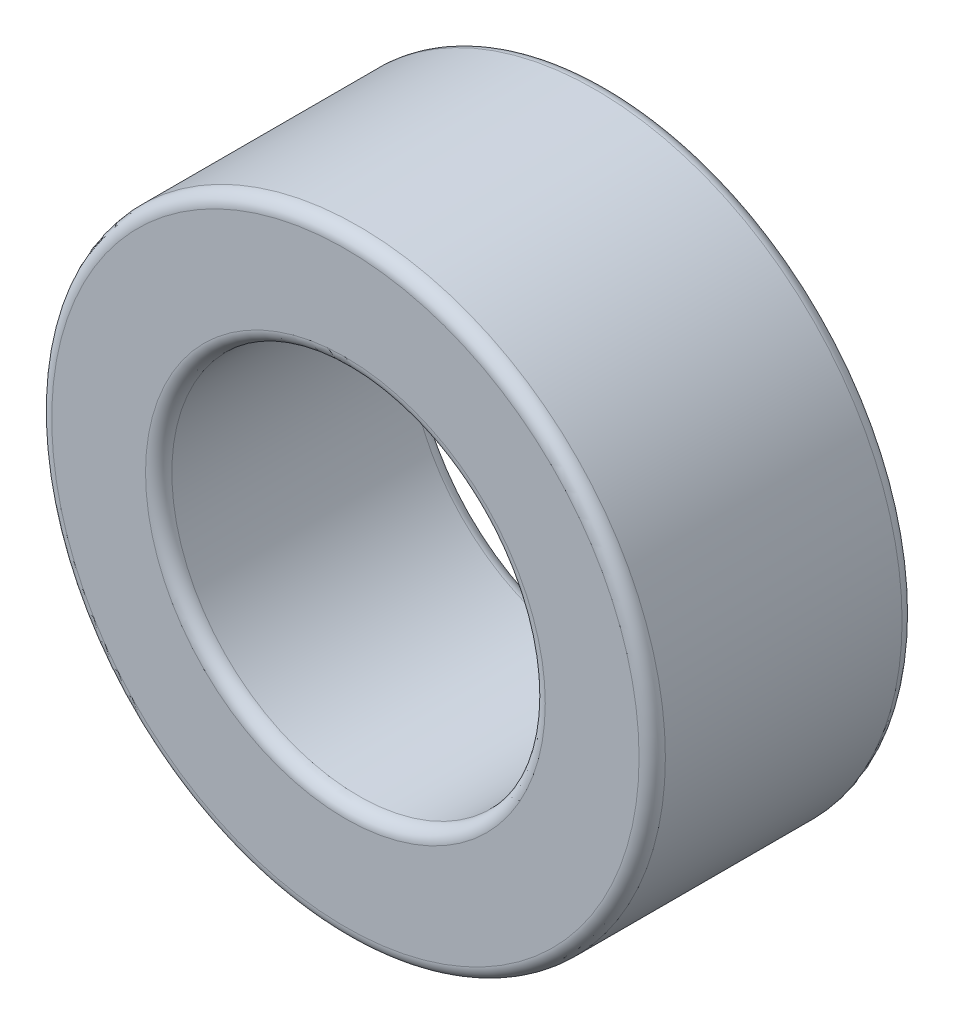
ISO-10303-21;
HEADER;
FILE_DESCRIPTION(('STEP AP214'),'2;1');
FILE_NAME('part.step','',(''),(''),'','','');
FILE_SCHEMA(('AUTOMOTIVE_DESIGN { 1 0 10303 214 1 1 1 1 }'));
ENDSEC;
DATA;
#1=APPLICATION_CONTEXT('core data for automotive mechanical design processes');
#2=APPLICATION_PROTOCOL_DEFINITION('international standard','automotive_design',2000,#1);
#3=PRODUCT_CONTEXT('',#1,'mechanical');
#4=PRODUCT('Part','Part','',(#3));
#5=PRODUCT_RELATED_PRODUCT_CATEGORY('part','',(#4));
#6=PRODUCT_DEFINITION_FORMATION('','',#4);
#7=PRODUCT_DEFINITION_CONTEXT('part definition',#1,'design');
#8=PRODUCT_DEFINITION('design','',#6,#7);
#9=PRODUCT_DEFINITION_SHAPE('','',#8);
#10=(LENGTH_UNIT() NAMED_UNIT(*) SI_UNIT(.MILLI.,.METRE.));
#11=(NAMED_UNIT(*) PLANE_ANGLE_UNIT() SI_UNIT($,.RADIAN.));
#12=(NAMED_UNIT(*) SI_UNIT($,.STERADIAN.) SOLID_ANGLE_UNIT());
#13=UNCERTAINTY_MEASURE_WITH_UNIT(LENGTH_MEASURE(1.E-05),#10,'distance_accuracy_value','');
#14=(GEOMETRIC_REPRESENTATION_CONTEXT(3) GLOBAL_UNCERTAINTY_ASSIGNED_CONTEXT((#13)) GLOBAL_UNIT_ASSIGNED_CONTEXT((#10,
#11,#12)) REPRESENTATION_CONTEXT('',''));
#15=CARTESIAN_POINT('',(0.,0.,0.));
#16=DIRECTION('',(0.,0.,1.));
#17=DIRECTION('',(1.,0.,0.));
#18=AXIS2_PLACEMENT_3D('',#15,#16,#17);
#19=CARTESIAN_POINT('',(0.,0.,3.));
#20=DIRECTION('',(0.,0.,1.));
#21=DIRECTION('',(1.,0.,0.));
#22=AXIS2_PLACEMENT_3D('',#19,#20,#21);
#23=PLANE('',#22);
#24=CARTESIAN_POINT('',(0.,0.,3.));
#25=DIRECTION('',(0.,0.,1.));
#26=DIRECTION('',(1.,0.,0.));
#27=AXIS2_PLACEMENT_3D('',#24,#25,#26);
#28=CIRCLE('',#27,2.28);
#29=CARTESIAN_POINT('',(2.28,0.,3.));
#30=VERTEX_POINT('',#29);
#31=EDGE_CURVE('E50',#30,#30,#28,.F.);
#32=ORIENTED_EDGE('',*,*,#31,.T.);
#33=EDGE_LOOP('',(#32));
#34=FACE_BOUND('',#33,.T.);
#35=CARTESIAN_POINT('',(0.,0.,3.));
#36=DIRECTION('',(0.,0.,1.));
#37=DIRECTION('',(1.,0.,0.));
#38=AXIS2_PLACEMENT_3D('',#35,#36,#37);
#39=CIRCLE('',#38,3.35);
#40=CARTESIAN_POINT('',(3.35,0.,3.));
#41=VERTEX_POINT('',#40);
#42=EDGE_CURVE('E55',#41,#41,#39,.T.);
#43=ORIENTED_EDGE('',*,*,#42,.T.);
#44=EDGE_LOOP('',(#43));
#45=FACE_BOUND('',#44,.T.);
#46=ADVANCED_FACE('F37',(#34,#45),#23,.T.);
#47=CARTESIAN_POINT('',(0.,0.,0.));
#48=DIRECTION('',(0.,0.,1.));
#49=DIRECTION('',(1.,0.,0.));
#50=AXIS2_PLACEMENT_3D('',#47,#48,#49);
#51=PLANE('',#50);
#52=CARTESIAN_POINT('',(0.,0.,0.));
#53=DIRECTION('',(0.,0.,1.));
#54=DIRECTION('',(1.,0.,0.));
#55=AXIS2_PLACEMENT_3D('',#52,#53,#54);
#56=CIRCLE('',#55,2.28);
#57=CARTESIAN_POINT('',(2.28,0.,0.));
#58=VERTEX_POINT('',#57);
#59=EDGE_CURVE('E69',#58,#58,#56,.T.);
#60=ORIENTED_EDGE('',*,*,#59,.T.);
#61=EDGE_LOOP('',(#60));
#62=FACE_BOUND('',#61,.T.);
#63=CARTESIAN_POINT('',(0.,0.,0.));
#64=DIRECTION('',(0.,0.,1.));
#65=DIRECTION('',(1.,0.,0.));
#66=AXIS2_PLACEMENT_3D('',#63,#64,#65);
#67=CIRCLE('',#66,3.35);
#68=CARTESIAN_POINT('',(3.35,0.,0.));
#69=VERTEX_POINT('',#68);
#70=EDGE_CURVE('E73',#69,#69,#67,.F.);
#71=ORIENTED_EDGE('',*,*,#70,.T.);
#72=EDGE_LOOP('',(#71));
#73=FACE_BOUND('',#72,.T.);
#74=ADVANCED_FACE('F78',(#62,#73),#51,.F.);
#75=CARTESIAN_POINT('',(0.,0.,3.));
#76=DIRECTION('',(0.,0.,-1.));
#77=DIRECTION('',(-1.,0.,0.));
#78=AXIS2_PLACEMENT_3D('',#75,#76,#77);
#79=CYLINDRICAL_SURFACE('',#78,3.5);
#80=CARTESIAN_POINT('',(0.,0.,0.15));
#81=DIRECTION('',(0.,0.,1.));
#82=DIRECTION('',(1.,0.,0.));
#83=AXIS2_PLACEMENT_3D('',#80,#81,#82);
#84=CIRCLE('',#83,3.5);
#85=CARTESIAN_POINT('',(3.5,0.,0.15));
#86=VERTEX_POINT('',#85);
#87=EDGE_CURVE('E10',#86,#86,#84,.T.);
#88=ORIENTED_EDGE('',*,*,#87,.T.);
#89=EDGE_LOOP('',(#88));
#90=FACE_BOUND('',#89,.T.);
#91=CARTESIAN_POINT('',(0.,0.,2.85));
#92=DIRECTION('',(0.,0.,1.));
#93=DIRECTION('',(1.,0.,0.));
#94=AXIS2_PLACEMENT_3D('',#91,#92,#93);
#95=CIRCLE('',#94,3.5);
#96=CARTESIAN_POINT('',(3.5,0.,2.85));
#97=VERTEX_POINT('',#96);
#98=EDGE_CURVE('E45',#97,#97,#95,.F.);
#99=ORIENTED_EDGE('',*,*,#98,.T.);
#100=EDGE_LOOP('',(#99));
#101=FACE_BOUND('',#100,.T.);
#102=ADVANCED_FACE('F98',(#90,#101),#79,.T.);
#103=CARTESIAN_POINT('',(0.,0.,3.));
#104=DIRECTION('',(0.,0.,-1.));
#105=DIRECTION('',(-1.,0.,0.));
#106=AXIS2_PLACEMENT_3D('',#103,#104,#105);
#107=CYLINDRICAL_SURFACE('',#106,2.13);
#108=CARTESIAN_POINT('',(0.,0.,0.15));
#109=DIRECTION('',(0.,0.,1.));
#110=DIRECTION('',(1.,0.,0.));
#111=AXIS2_PLACEMENT_3D('',#108,#109,#110);
#112=CIRCLE('',#111,2.13);
#113=CARTESIAN_POINT('',(2.13,0.,0.15));
#114=VERTEX_POINT('',#113);
#115=EDGE_CURVE('E61',#114,#114,#112,.F.);
#116=ORIENTED_EDGE('',*,*,#115,.T.);
#117=EDGE_LOOP('',(#116));
#118=FACE_BOUND('',#117,.T.);
#119=CARTESIAN_POINT('',(0.,0.,2.85));
#120=DIRECTION('',(0.,0.,1.));
#121=DIRECTION('',(1.,0.,0.));
#122=AXIS2_PLACEMENT_3D('',#119,#120,#121);
#123=CIRCLE('',#122,2.13);
#124=CARTESIAN_POINT('',(2.13,0.,2.85));
#125=VERTEX_POINT('',#124);
#126=EDGE_CURVE('E65',#125,#125,#123,.T.);
#127=ORIENTED_EDGE('',*,*,#126,.T.);
#128=EDGE_LOOP('',(#127));
#129=FACE_BOUND('',#128,.T.);
#130=ADVANCED_FACE('F103',(#118,#129),#107,.F.);
#131=CARTESIAN_POINT('',(0.,0.,0.15));
#132=DIRECTION('',(0.,0.,1.));
#133=DIRECTION('',(1.,0.,0.));
#134=AXIS2_PLACEMENT_3D('',#131,#132,#133);
#135=TOROIDAL_SURFACE('',#134,2.28,0.15);
#136=ORIENTED_EDGE('',*,*,#115,.F.);
#137=EDGE_LOOP('',(#136));
#138=FACE_BOUND('',#137,.T.);
#139=ORIENTED_EDGE('',*,*,#59,.F.);
#140=EDGE_LOOP('',(#139));
#141=FACE_BOUND('',#140,.T.);
#142=ADVANCED_FACE('F89',(#138,#141),#135,.T.);
#143=CARTESIAN_POINT('',(0.,0.,2.85));
#144=DIRECTION('',(0.,0.,1.));
#145=DIRECTION('',(1.,0.,0.));
#146=AXIS2_PLACEMENT_3D('',#143,#144,#145);
#147=TOROIDAL_SURFACE('',#146,2.28,0.15);
#148=ORIENTED_EDGE('',*,*,#31,.F.);
#149=EDGE_LOOP('',(#148));
#150=FACE_BOUND('',#149,.T.);
#151=ORIENTED_EDGE('',*,*,#126,.F.);
#152=EDGE_LOOP('',(#151));
#153=FACE_BOUND('',#152,.T.);
#154=ADVANCED_FACE('F83',(#150,#153),#147,.T.);
#155=CARTESIAN_POINT('',(0.,0.,0.15));
#156=DIRECTION('',(0.,0.,1.));
#157=DIRECTION('',(1.,0.,0.));
#158=AXIS2_PLACEMENT_3D('',#155,#156,#157);
#159=TOROIDAL_SURFACE('',#158,3.35,0.15);
#160=ORIENTED_EDGE('',*,*,#70,.F.);
#161=EDGE_LOOP('',(#160));
#162=FACE_BOUND('',#161,.T.);
#163=ORIENTED_EDGE('',*,*,#87,.F.);
#164=EDGE_LOOP('',(#163));
#165=FACE_BOUND('',#164,.T.);
#166=ADVANCED_FACE('F80',(#162,#165),#159,.T.);
#167=CARTESIAN_POINT('',(0.,0.,2.85));
#168=DIRECTION('',(0.,0.,1.));
#169=DIRECTION('',(1.,0.,0.));
#170=AXIS2_PLACEMENT_3D('',#167,#168,#169);
#171=TOROIDAL_SURFACE('',#170,3.35,0.15);
#172=ORIENTED_EDGE('',*,*,#98,.F.);
#173=EDGE_LOOP('',(#172));
#174=FACE_BOUND('',#173,.T.);
#175=ORIENTED_EDGE('',*,*,#42,.F.);
#176=EDGE_LOOP('',(#175));
#177=FACE_BOUND('',#176,.T.);
#178=ADVANCED_FACE('F39',(#174,#177),#171,.T.);
#179=CLOSED_SHELL('',(#46,#74,#102,#130,#142,#154,#166,#178));
#180=MANIFOLD_SOLID_BREP('B2',#179);
#181=ADVANCED_BREP_SHAPE_REPRESENTATION('',(#18,#180),#14);
#182=SHAPE_DEFINITION_REPRESENTATION(#9,#181);
ENDSEC;
END-ISO-10303-21;
